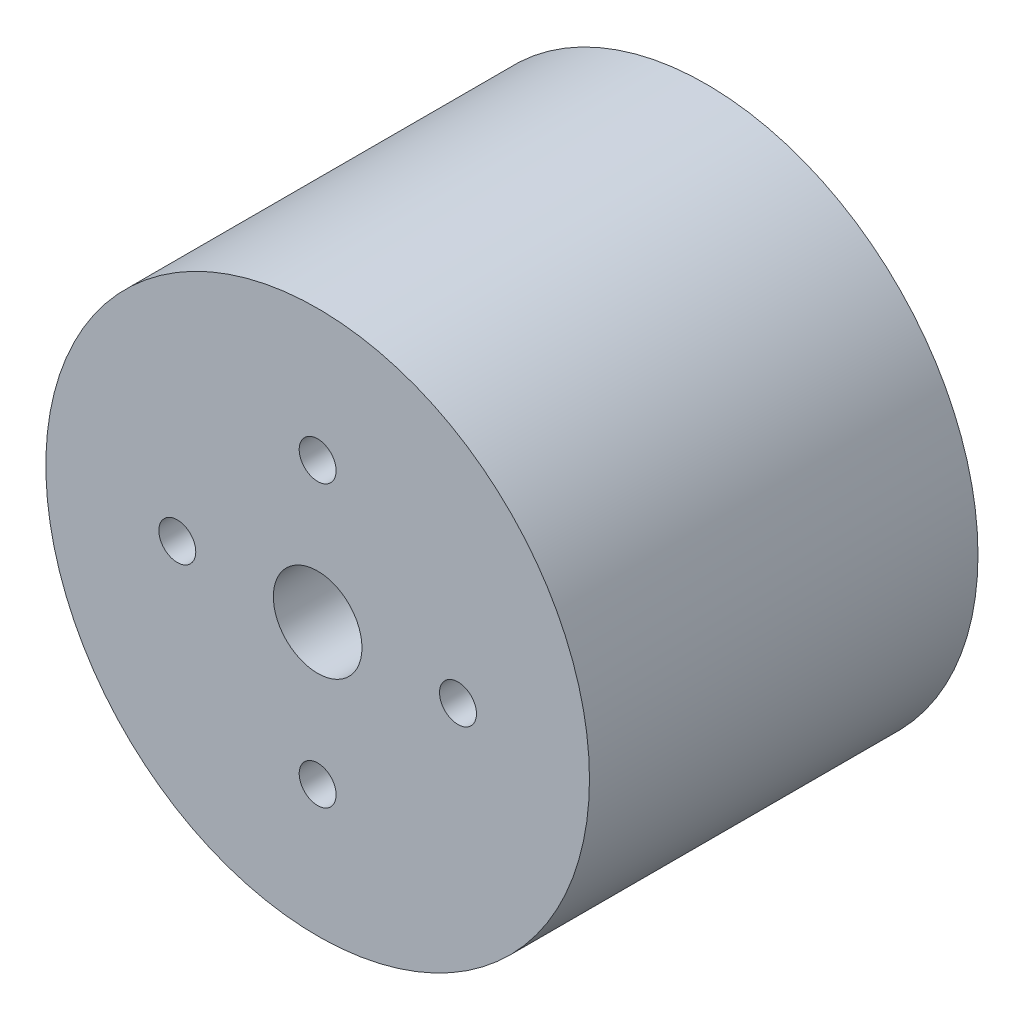
ISO-10303-21;
HEADER;
FILE_DESCRIPTION(('STEP AP214'),'2;1');
FILE_NAME('part.step','',(''),(''),'','','');
FILE_SCHEMA(('AUTOMOTIVE_DESIGN { 1 0 10303 214 1 1 1 1 }'));
ENDSEC;
DATA;
#1=APPLICATION_CONTEXT('core data for automotive mechanical design processes');
#2=APPLICATION_PROTOCOL_DEFINITION('international standard','automotive_design',2000,#1);
#3=PRODUCT_CONTEXT('',#1,'mechanical');
#4=PRODUCT('Part','Part','',(#3));
#5=PRODUCT_RELATED_PRODUCT_CATEGORY('part','',(#4));
#6=PRODUCT_DEFINITION_FORMATION('','',#4);
#7=PRODUCT_DEFINITION_CONTEXT('part definition',#1,'design');
#8=PRODUCT_DEFINITION('design','',#6,#7);
#9=PRODUCT_DEFINITION_SHAPE('','',#8);
#10=(LENGTH_UNIT() NAMED_UNIT(*) SI_UNIT(.MILLI.,.METRE.));
#11=(NAMED_UNIT(*) PLANE_ANGLE_UNIT() SI_UNIT($,.RADIAN.));
#12=(NAMED_UNIT(*) SI_UNIT($,.STERADIAN.) SOLID_ANGLE_UNIT());
#13=UNCERTAINTY_MEASURE_WITH_UNIT(LENGTH_MEASURE(1.E-05),#10,'distance_accuracy_value','');
#14=(GEOMETRIC_REPRESENTATION_CONTEXT(3) GLOBAL_UNCERTAINTY_ASSIGNED_CONTEXT((#13)) GLOBAL_UNIT_ASSIGNED_CONTEXT((#10,
#11,#12)) REPRESENTATION_CONTEXT('',''));
#15=CARTESIAN_POINT('',(0.,0.,0.));
#16=DIRECTION('',(0.,0.,1.));
#17=DIRECTION('',(1.,0.,0.));
#18=AXIS2_PLACEMENT_3D('',#15,#16,#17);
#19=CARTESIAN_POINT('',(0.,0.,26.3));
#20=DIRECTION('',(0.,0.,-1.));
#21=DIRECTION('',(-1.,0.,0.));
#22=AXIS2_PLACEMENT_3D('',#19,#20,#21);
#23=CYLINDRICAL_SURFACE('',#22,18.4);
#24=CARTESIAN_POINT('',(0.,0.,26.3));
#25=DIRECTION('',(0.,0.,1.));
#26=DIRECTION('',(1.,0.,0.));
#27=AXIS2_PLACEMENT_3D('',#24,#25,#26);
#28=CIRCLE('',#27,18.4);
#29=CARTESIAN_POINT('',(18.4,0.,26.3));
#30=VERTEX_POINT('',#29);
#31=EDGE_CURVE('E10',#30,#30,#28,.T.);
#32=ORIENTED_EDGE('',*,*,#31,.F.);
#33=EDGE_LOOP('',(#32));
#34=FACE_BOUND('',#33,.T.);
#35=CARTESIAN_POINT('',(0.,0.,0.));
#36=DIRECTION('',(0.,0.,1.));
#37=DIRECTION('',(1.,0.,0.));
#38=AXIS2_PLACEMENT_3D('',#35,#36,#37);
#39=CIRCLE('',#38,18.4);
#40=CARTESIAN_POINT('',(18.4,0.,0.));
#41=VERTEX_POINT('',#40);
#42=EDGE_CURVE('E34',#41,#41,#39,.T.);
#43=ORIENTED_EDGE('',*,*,#42,.T.);
#44=EDGE_LOOP('',(#43));
#45=FACE_BOUND('',#44,.T.);
#46=ADVANCED_FACE('F31',(#34,#45),#23,.T.);
#47=CARTESIAN_POINT('',(0.,0.,26.3));
#48=DIRECTION('',(0.,0.,1.));
#49=DIRECTION('',(1.,0.,0.));
#50=AXIS2_PLACEMENT_3D('',#47,#48,#49);
#51=PLANE('',#50);
#52=CARTESIAN_POINT('',(0.,9.5,26.3));
#53=DIRECTION('',(0.,0.,1.));
#54=DIRECTION('',(1.,0.,0.));
#55=AXIS2_PLACEMENT_3D('',#52,#53,#54);
#56=CIRCLE('',#55,1.25);
#57=CARTESIAN_POINT('',(1.25,9.5,26.3));
#58=VERTEX_POINT('',#57);
#59=EDGE_CURVE('E56',#58,#58,#56,.T.);
#60=ORIENTED_EDGE('',*,*,#59,.F.);
#61=EDGE_LOOP('',(#60));
#62=FACE_BOUND('',#61,.T.);
#63=CARTESIAN_POINT('',(9.50000000000027,2.68842825129648E-13,26.3));
#64=DIRECTION('',(0.,0.,1.));
#65=DIRECTION('',(1.,0.,0.));
#66=AXIS2_PLACEMENT_3D('',#63,#64,#65);
#67=CIRCLE('',#66,1.25000000000021);
#68=CARTESIAN_POINT('',(10.7500000000005,2.68842825129648E-13,26.3));
#69=VERTEX_POINT('',#68);
#70=EDGE_CURVE('E49',#69,#69,#67,.T.);
#71=ORIENTED_EDGE('',*,*,#70,.F.);
#72=EDGE_LOOP('',(#71));
#73=FACE_BOUND('',#72,.T.);
#74=CARTESIAN_POINT('',(5.37685650259296E-13,-9.5,26.3));
#75=DIRECTION('',(0.,0.,1.));
#76=DIRECTION('',(1.,0.,0.));
#77=AXIS2_PLACEMENT_3D('',#74,#75,#76);
#78=CIRCLE('',#77,1.25000000000058);
#79=CARTESIAN_POINT('',(1.25000000000112,-9.5,26.3));
#80=VERTEX_POINT('',#79);
#81=EDGE_CURVE('E68',#80,#80,#78,.T.);
#82=ORIENTED_EDGE('',*,*,#81,.F.);
#83=EDGE_LOOP('',(#82));
#84=FACE_BOUND('',#83,.T.);
#85=CARTESIAN_POINT('',(-9.49999999999973,-2.70006239588838E-13,26.3));
#86=DIRECTION('',(0.,0.,1.));
#87=DIRECTION('',(1.,0.,0.));
#88=AXIS2_PLACEMENT_3D('',#85,#86,#87);
#89=CIRCLE('',#88,1.25000000000043);
#90=CARTESIAN_POINT('',(-8.2499999999993,-2.70006239588838E-13,26.3));
#91=VERTEX_POINT('',#90);
#92=EDGE_CURVE('E61',#91,#91,#89,.T.);
#93=ORIENTED_EDGE('',*,*,#92,.F.);
#94=EDGE_LOOP('',(#93));
#95=FACE_BOUND('',#94,.T.);
#96=CARTESIAN_POINT('',(0.,0.,26.3));
#97=DIRECTION('',(0.,0.,1.));
#98=DIRECTION('',(1.,0.,0.));
#99=AXIS2_PLACEMENT_3D('',#96,#97,#98);
#100=CIRCLE('',#99,3.);
#101=CARTESIAN_POINT('',(3.,0.,26.3));
#102=VERTEX_POINT('',#101);
#103=EDGE_CURVE('E43',#102,#102,#100,.T.);
#104=ORIENTED_EDGE('',*,*,#103,.F.);
#105=EDGE_LOOP('',(#104));
#106=FACE_BOUND('',#105,.T.);
#107=ORIENTED_EDGE('',*,*,#31,.T.);
#108=EDGE_LOOP('',(#107));
#109=FACE_BOUND('',#108,.T.);
#110=ADVANCED_FACE('F110',(#62,#73,#84,#95,#106,#109),#51,.T.);
#111=CARTESIAN_POINT('',(0.,0.,0.));
#112=DIRECTION('',(0.,0.,1.));
#113=DIRECTION('',(1.,0.,0.));
#114=AXIS2_PLACEMENT_3D('',#111,#112,#113);
#115=PLANE('',#114);
#116=CARTESIAN_POINT('',(10.,0.,0.));
#117=DIRECTION('',(0.,0.,-1.));
#118=DIRECTION('',(-1.,0.,0.));
#119=AXIS2_PLACEMENT_3D('',#116,#117,#118);
#120=CIRCLE('',#119,1.25);
#121=CARTESIAN_POINT('',(8.75,0.,0.));
#122=VERTEX_POINT('',#121);
#123=EDGE_CURVE('E91',#122,#122,#120,.T.);
#124=ORIENTED_EDGE('',*,*,#123,.F.);
#125=EDGE_LOOP('',(#124));
#126=FACE_BOUND('',#125,.T.);
#127=CARTESIAN_POINT('',(0.,10.,0.));
#128=DIRECTION('',(0.,0.,-1.));
#129=DIRECTION('',(-1.,0.,0.));
#130=AXIS2_PLACEMENT_3D('',#127,#128,#129);
#131=CIRCLE('',#130,1.25);
#132=CARTESIAN_POINT('',(-1.25000000000003,10.,0.));
#133=VERTEX_POINT('',#132);
#134=EDGE_CURVE('E85',#133,#133,#131,.T.);
#135=ORIENTED_EDGE('',*,*,#134,.F.);
#136=EDGE_LOOP('',(#135));
#137=FACE_BOUND('',#136,.T.);
#138=CARTESIAN_POINT('',(-10.,0.,0.));
#139=DIRECTION('',(0.,0.,-1.));
#140=DIRECTION('',(-1.,0.,0.));
#141=AXIS2_PLACEMENT_3D('',#138,#139,#140);
#142=CIRCLE('',#141,1.25);
#143=CARTESIAN_POINT('',(-11.25,0.,0.));
#144=VERTEX_POINT('',#143);
#145=EDGE_CURVE('E79',#144,#144,#142,.T.);
#146=ORIENTED_EDGE('',*,*,#145,.F.);
#147=EDGE_LOOP('',(#146));
#148=FACE_BOUND('',#147,.T.);
#149=CARTESIAN_POINT('',(1.04744440165294E-13,-10.,0.));
#150=DIRECTION('',(0.,0.,-1.));
#151=DIRECTION('',(-1.,0.,0.));
#152=AXIS2_PLACEMENT_3D('',#149,#150,#151);
#153=CIRCLE('',#152,1.25);
#154=CARTESIAN_POINT('',(-1.24999999999989,-10.,0.));
#155=VERTEX_POINT('',#154);
#156=EDGE_CURVE('E73',#155,#155,#153,.T.);
#157=ORIENTED_EDGE('',*,*,#156,.F.);
#158=EDGE_LOOP('',(#157));
#159=FACE_BOUND('',#158,.T.);
#160=ORIENTED_EDGE('',*,*,#42,.F.);
#161=EDGE_LOOP('',(#160));
#162=FACE_BOUND('',#161,.T.);
#163=ADVANCED_FACE('F106',(#126,#137,#148,#159,#162),#115,.F.);
#164=CARTESIAN_POINT('',(0.,0.,21.3));
#165=DIRECTION('',(0.,0.,1.));
#166=DIRECTION('',(1.,0.,0.));
#167=AXIS2_PLACEMENT_3D('',#164,#165,#166);
#168=CYLINDRICAL_SURFACE('',#167,3.);
#169=CARTESIAN_POINT('',(0.,0.,21.3));
#170=DIRECTION('',(0.,0.,1.));
#171=DIRECTION('',(1.,0.,0.));
#172=AXIS2_PLACEMENT_3D('',#169,#170,#171);
#173=CIRCLE('',#172,3.);
#174=CARTESIAN_POINT('',(3.,0.,21.3));
#175=VERTEX_POINT('',#174);
#176=EDGE_CURVE('E41',#175,#175,#173,.T.);
#177=ORIENTED_EDGE('',*,*,#176,.F.);
#178=EDGE_LOOP('',(#177));
#179=FACE_BOUND('',#178,.T.);
#180=ORIENTED_EDGE('',*,*,#103,.T.);
#181=EDGE_LOOP('',(#180));
#182=FACE_BOUND('',#181,.T.);
#183=ADVANCED_FACE('F109',(#179,#182),#168,.F.);
#184=CARTESIAN_POINT('',(0.,0.,21.3));
#185=DIRECTION('',(0.,0.,1.));
#186=DIRECTION('',(1.,0.,0.));
#187=AXIS2_PLACEMENT_3D('',#184,#185,#186);
#188=PLANE('',#187);
#189=ORIENTED_EDGE('',*,*,#176,.T.);
#190=EDGE_LOOP('',(#189));
#191=FACE_BOUND('',#190,.T.);
#192=ADVANCED_FACE('F133',(#191),#188,.T.);
#193=CARTESIAN_POINT('',(-9.49999999999973,-2.70006239588838E-13,21.3));
#194=DIRECTION('',(0.,0.,1.));
#195=DIRECTION('',(1.,0.,0.));
#196=AXIS2_PLACEMENT_3D('',#193,#194,#195);
#197=CYLINDRICAL_SURFACE('',#196,1.25000000000043);
#198=CARTESIAN_POINT('',(-9.49999999999973,-2.70006239588838E-13,21.3));
#199=DIRECTION('',(0.,0.,1.));
#200=DIRECTION('',(1.,0.,0.));
#201=AXIS2_PLACEMENT_3D('',#198,#199,#200);
#202=CIRCLE('',#201,1.25000000000043);
#203=CARTESIAN_POINT('',(-8.2499999999993,-2.70006239588838E-13,21.3));
#204=VERTEX_POINT('',#203);
#205=EDGE_CURVE('E64',#204,#204,#202,.T.);
#206=ORIENTED_EDGE('',*,*,#205,.F.);
#207=EDGE_LOOP('',(#206));
#208=FACE_BOUND('',#207,.T.);
#209=ORIENTED_EDGE('',*,*,#92,.T.);
#210=EDGE_LOOP('',(#209));
#211=FACE_BOUND('',#210,.T.);
#212=ADVANCED_FACE('F137',(#208,#211),#197,.F.);
#213=CARTESIAN_POINT('',(-9.49999999999973,-2.70006239588838E-13,21.3));
#214=DIRECTION('',(0.,0.,1.));
#215=DIRECTION('',(1.,0.,0.));
#216=AXIS2_PLACEMENT_3D('',#213,#214,#215);
#217=PLANE('',#216);
#218=ORIENTED_EDGE('',*,*,#205,.T.);
#219=EDGE_LOOP('',(#218));
#220=FACE_BOUND('',#219,.T.);
#221=ADVANCED_FACE('F159',(#220),#217,.T.);
#222=CARTESIAN_POINT('',(5.37685650259296E-13,-9.5,21.3));
#223=DIRECTION('',(0.,0.,1.));
#224=DIRECTION('',(1.,0.,0.));
#225=AXIS2_PLACEMENT_3D('',#222,#223,#224);
#226=CYLINDRICAL_SURFACE('',#225,1.25000000000058);
#227=CARTESIAN_POINT('',(5.37685650259296E-13,-9.5,21.3));
#228=DIRECTION('',(0.,0.,1.));
#229=DIRECTION('',(1.,0.,0.));
#230=AXIS2_PLACEMENT_3D('',#227,#228,#229);
#231=CIRCLE('',#230,1.25000000000058);
#232=CARTESIAN_POINT('',(1.25000000000112,-9.5,21.3));
#233=VERTEX_POINT('',#232);
#234=EDGE_CURVE('E53',#233,#233,#231,.T.);
#235=ORIENTED_EDGE('',*,*,#234,.F.);
#236=EDGE_LOOP('',(#235));
#237=FACE_BOUND('',#236,.T.);
#238=ORIENTED_EDGE('',*,*,#81,.T.);
#239=EDGE_LOOP('',(#238));
#240=FACE_BOUND('',#239,.T.);
#241=ADVANCED_FACE('F163',(#237,#240),#226,.F.);
#242=CARTESIAN_POINT('',(5.37685650259296E-13,-9.5,21.3));
#243=DIRECTION('',(0.,0.,1.));
#244=DIRECTION('',(1.,0.,0.));
#245=AXIS2_PLACEMENT_3D('',#242,#243,#244);
#246=PLANE('',#245);
#247=ORIENTED_EDGE('',*,*,#234,.T.);
#248=EDGE_LOOP('',(#247));
#249=FACE_BOUND('',#248,.T.);
#250=ADVANCED_FACE('F143',(#249),#246,.T.);
#251=CARTESIAN_POINT('',(9.50000000000027,2.68842825129648E-13,21.3));
#252=DIRECTION('',(0.,0.,1.));
#253=DIRECTION('',(1.,0.,0.));
#254=AXIS2_PLACEMENT_3D('',#251,#252,#253);
#255=CYLINDRICAL_SURFACE('',#254,1.25000000000021);
#256=CARTESIAN_POINT('',(9.50000000000027,2.68842825129648E-13,21.3));
#257=DIRECTION('',(0.,0.,1.));
#258=DIRECTION('',(1.,0.,0.));
#259=AXIS2_PLACEMENT_3D('',#256,#257,#258);
#260=CIRCLE('',#259,1.25000000000021);
#261=CARTESIAN_POINT('',(10.7500000000005,2.68842825129648E-13,21.3));
#262=VERTEX_POINT('',#261);
#263=EDGE_CURVE('E52',#262,#262,#260,.T.);
#264=ORIENTED_EDGE('',*,*,#263,.F.);
#265=EDGE_LOOP('',(#264));
#266=FACE_BOUND('',#265,.T.);
#267=ORIENTED_EDGE('',*,*,#70,.T.);
#268=EDGE_LOOP('',(#267));
#269=FACE_BOUND('',#268,.T.);
#270=ADVANCED_FACE('F139',(#266,#269),#255,.F.);
#271=CARTESIAN_POINT('',(9.50000000000027,2.68842825129648E-13,21.3));
#272=DIRECTION('',(0.,0.,1.));
#273=DIRECTION('',(1.,0.,0.));
#274=AXIS2_PLACEMENT_3D('',#271,#272,#273);
#275=PLANE('',#274);
#276=ORIENTED_EDGE('',*,*,#263,.T.);
#277=EDGE_LOOP('',(#276));
#278=FACE_BOUND('',#277,.T.);
#279=ADVANCED_FACE('F142',(#278),#275,.T.);
#280=CARTESIAN_POINT('',(0.,9.5,21.3));
#281=DIRECTION('',(0.,0.,1.));
#282=DIRECTION('',(1.,0.,0.));
#283=AXIS2_PLACEMENT_3D('',#280,#281,#282);
#284=CYLINDRICAL_SURFACE('',#283,1.25);
#285=CARTESIAN_POINT('',(0.,9.5,21.3));
#286=DIRECTION('',(0.,0.,1.));
#287=DIRECTION('',(1.,0.,0.));
#288=AXIS2_PLACEMENT_3D('',#285,#286,#287);
#289=CIRCLE('',#288,1.25);
#290=CARTESIAN_POINT('',(1.25,9.5,21.3));
#291=VERTEX_POINT('',#290);
#292=EDGE_CURVE('E46',#291,#291,#289,.T.);
#293=ORIENTED_EDGE('',*,*,#292,.F.);
#294=EDGE_LOOP('',(#293));
#295=FACE_BOUND('',#294,.T.);
#296=ORIENTED_EDGE('',*,*,#59,.T.);
#297=EDGE_LOOP('',(#296));
#298=FACE_BOUND('',#297,.T.);
#299=ADVANCED_FACE('F147',(#295,#298),#284,.F.);
#300=CARTESIAN_POINT('',(0.,9.5,21.3));
#301=DIRECTION('',(0.,0.,1.));
#302=DIRECTION('',(1.,0.,0.));
#303=AXIS2_PLACEMENT_3D('',#300,#301,#302);
#304=PLANE('',#303);
#305=ORIENTED_EDGE('',*,*,#292,.T.);
#306=EDGE_LOOP('',(#305));
#307=FACE_BOUND('',#306,.T.);
#308=ADVANCED_FACE('F151',(#307),#304,.T.);
#309=CARTESIAN_POINT('',(1.04744440165294E-13,-10.,5.));
#310=DIRECTION('',(0.,0.,-1.));
#311=DIRECTION('',(-1.,0.,0.));
#312=AXIS2_PLACEMENT_3D('',#309,#310,#311);
#313=CYLINDRICAL_SURFACE('',#312,1.25);
#314=CARTESIAN_POINT('',(1.04744440165294E-13,-10.,5.));
#315=DIRECTION('',(0.,0.,-1.));
#316=DIRECTION('',(-1.,0.,0.));
#317=AXIS2_PLACEMENT_3D('',#314,#315,#316);
#318=CIRCLE('',#317,1.25);
#319=CARTESIAN_POINT('',(-1.24999999999989,-10.,5.));
#320=VERTEX_POINT('',#319);
#321=EDGE_CURVE('E76',#320,#320,#318,.T.);
#322=ORIENTED_EDGE('',*,*,#321,.F.);
#323=EDGE_LOOP('',(#322));
#324=FACE_BOUND('',#323,.T.);
#325=ORIENTED_EDGE('',*,*,#156,.T.);
#326=EDGE_LOOP('',(#325));
#327=FACE_BOUND('',#326,.T.);
#328=ADVANCED_FACE('F155',(#324,#327),#313,.F.);
#329=CARTESIAN_POINT('',(1.04744440165294E-13,-10.,5.));
#330=DIRECTION('',(0.,0.,-1.));
#331=DIRECTION('',(-1.,0.,0.));
#332=AXIS2_PLACEMENT_3D('',#329,#330,#331);
#333=PLANE('',#332);
#334=ORIENTED_EDGE('',*,*,#321,.T.);
#335=EDGE_LOOP('',(#334));
#336=FACE_BOUND('',#335,.T.);
#337=ADVANCED_FACE('F173',(#336),#333,.T.);
#338=CARTESIAN_POINT('',(-10.,0.,5.));
#339=DIRECTION('',(0.,0.,-1.));
#340=DIRECTION('',(-1.,0.,0.));
#341=AXIS2_PLACEMENT_3D('',#338,#339,#340);
#342=CYLINDRICAL_SURFACE('',#341,1.25);
#343=CARTESIAN_POINT('',(-10.,0.,5.));
#344=DIRECTION('',(0.,0.,-1.));
#345=DIRECTION('',(-1.,0.,0.));
#346=AXIS2_PLACEMENT_3D('',#343,#344,#345);
#347=CIRCLE('',#346,1.25);
#348=CARTESIAN_POINT('',(-11.25,0.,5.));
#349=VERTEX_POINT('',#348);
#350=EDGE_CURVE('E82',#349,#349,#347,.T.);
#351=ORIENTED_EDGE('',*,*,#350,.F.);
#352=EDGE_LOOP('',(#351));
#353=FACE_BOUND('',#352,.T.);
#354=ORIENTED_EDGE('',*,*,#145,.T.);
#355=EDGE_LOOP('',(#354));
#356=FACE_BOUND('',#355,.T.);
#357=ADVANCED_FACE('F177',(#353,#356),#342,.F.);
#358=CARTESIAN_POINT('',(-10.,0.,5.));
#359=DIRECTION('',(0.,0.,-1.));
#360=DIRECTION('',(-1.,0.,0.));
#361=AXIS2_PLACEMENT_3D('',#358,#359,#360);
#362=PLANE('',#361);
#363=ORIENTED_EDGE('',*,*,#350,.T.);
#364=EDGE_LOOP('',(#363));
#365=FACE_BOUND('',#364,.T.);
#366=ADVANCED_FACE('F181',(#365),#362,.T.);
#367=CARTESIAN_POINT('',(0.,10.,5.));
#368=DIRECTION('',(0.,0.,-1.));
#369=DIRECTION('',(-1.,0.,0.));
#370=AXIS2_PLACEMENT_3D('',#367,#368,#369);
#371=CYLINDRICAL_SURFACE('',#370,1.25);
#372=CARTESIAN_POINT('',(0.,10.,5.));
#373=DIRECTION('',(0.,0.,-1.));
#374=DIRECTION('',(-1.,0.,0.));
#375=AXIS2_PLACEMENT_3D('',#372,#373,#374);
#376=CIRCLE('',#375,1.25);
#377=CARTESIAN_POINT('',(-1.25000000000003,10.,5.));
#378=VERTEX_POINT('',#377);
#379=EDGE_CURVE('E88',#378,#378,#376,.T.);
#380=ORIENTED_EDGE('',*,*,#379,.F.);
#381=EDGE_LOOP('',(#380));
#382=FACE_BOUND('',#381,.T.);
#383=ORIENTED_EDGE('',*,*,#134,.T.);
#384=EDGE_LOOP('',(#383));
#385=FACE_BOUND('',#384,.T.);
#386=ADVANCED_FACE('F185',(#382,#385),#371,.F.);
#387=CARTESIAN_POINT('',(0.,10.,5.));
#388=DIRECTION('',(0.,0.,-1.));
#389=DIRECTION('',(-1.,0.,0.));
#390=AXIS2_PLACEMENT_3D('',#387,#388,#389);
#391=PLANE('',#390);
#392=ORIENTED_EDGE('',*,*,#379,.T.);
#393=EDGE_LOOP('',(#392));
#394=FACE_BOUND('',#393,.T.);
#395=ADVANCED_FACE('F102',(#394),#391,.T.);
#396=CARTESIAN_POINT('',(10.,0.,5.));
#397=DIRECTION('',(0.,0.,-1.));
#398=DIRECTION('',(-1.,0.,0.));
#399=AXIS2_PLACEMENT_3D('',#396,#397,#398);
#400=CYLINDRICAL_SURFACE('',#399,1.25);
#401=CARTESIAN_POINT('',(10.,0.,5.));
#402=DIRECTION('',(0.,0.,-1.));
#403=DIRECTION('',(-1.,0.,0.));
#404=AXIS2_PLACEMENT_3D('',#401,#402,#403);
#405=CIRCLE('',#404,1.25);
#406=CARTESIAN_POINT('',(8.75,0.,5.));
#407=VERTEX_POINT('',#406);
#408=EDGE_CURVE('E65',#407,#407,#405,.T.);
#409=ORIENTED_EDGE('',*,*,#408,.F.);
#410=EDGE_LOOP('',(#409));
#411=FACE_BOUND('',#410,.T.);
#412=ORIENTED_EDGE('',*,*,#123,.T.);
#413=EDGE_LOOP('',(#412));
#414=FACE_BOUND('',#413,.T.);
#415=ADVANCED_FACE('F99',(#411,#414),#400,.F.);
#416=CARTESIAN_POINT('',(10.,0.,5.));
#417=DIRECTION('',(0.,0.,-1.));
#418=DIRECTION('',(-1.,0.,0.));
#419=AXIS2_PLACEMENT_3D('',#416,#417,#418);
#420=PLANE('',#419);
#421=ORIENTED_EDGE('',*,*,#408,.T.);
#422=EDGE_LOOP('',(#421));
#423=FACE_BOUND('',#422,.T.);
#424=ADVANCED_FACE('F97',(#423),#420,.T.);
#425=CLOSED_SHELL('',(#46,#110,#163,#183,#192,#212,#221,#241,#250,#270,#279,#299,#308,#328,#337,
#357,#366,#386,#395,#415,#424));
#426=MANIFOLD_SOLID_BREP('B2',#425);
#427=ADVANCED_BREP_SHAPE_REPRESENTATION('',(#18,#426),#14);
#428=SHAPE_DEFINITION_REPRESENTATION(#9,#427);
ENDSEC;
END-ISO-10303-21;
